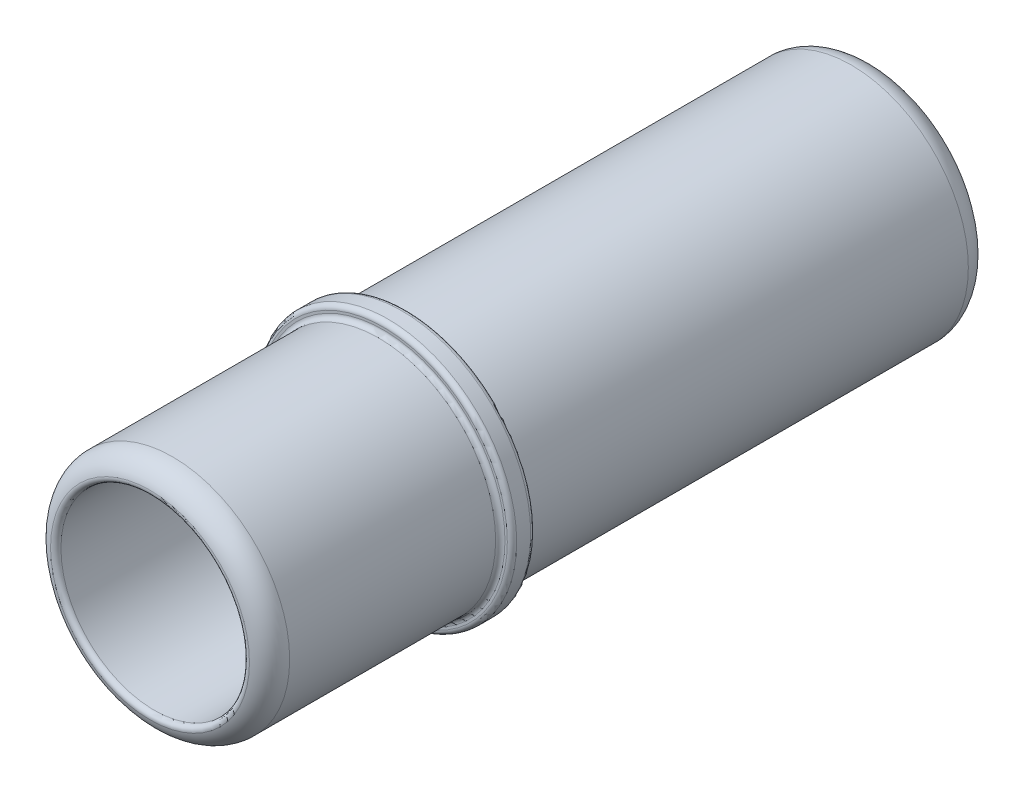
ISO-10303-21;
HEADER;
FILE_DESCRIPTION(('STEP AP214'),'2;1');
FILE_NAME('part.step','',(''),(''),'','','');
FILE_SCHEMA(('AUTOMOTIVE_DESIGN { 1 0 10303 214 1 1 1 1 }'));
ENDSEC;
DATA;
#1=APPLICATION_CONTEXT('core data for automotive mechanical design processes');
#2=APPLICATION_PROTOCOL_DEFINITION('international standard','automotive_design',2000,#1);
#3=PRODUCT_CONTEXT('',#1,'mechanical');
#4=PRODUCT('Part','Part','',(#3));
#5=PRODUCT_RELATED_PRODUCT_CATEGORY('part','',(#4));
#6=PRODUCT_DEFINITION_FORMATION('','',#4);
#7=PRODUCT_DEFINITION_CONTEXT('part definition',#1,'design');
#8=PRODUCT_DEFINITION('design','',#6,#7);
#9=PRODUCT_DEFINITION_SHAPE('','',#8);
#10=(LENGTH_UNIT() NAMED_UNIT(*) SI_UNIT(.MILLI.,.METRE.));
#11=(NAMED_UNIT(*) PLANE_ANGLE_UNIT() SI_UNIT($,.RADIAN.));
#12=(NAMED_UNIT(*) SI_UNIT($,.STERADIAN.) SOLID_ANGLE_UNIT());
#13=UNCERTAINTY_MEASURE_WITH_UNIT(LENGTH_MEASURE(1.E-05),#10,'distance_accuracy_value','');
#14=(GEOMETRIC_REPRESENTATION_CONTEXT(3) GLOBAL_UNCERTAINTY_ASSIGNED_CONTEXT((#13)) GLOBAL_UNIT_ASSIGNED_CONTEXT((#10,
#11,#12)) REPRESENTATION_CONTEXT('',''));
#15=CARTESIAN_POINT('',(0.,0.,0.));
#16=DIRECTION('',(0.,0.,1.));
#17=DIRECTION('',(1.,0.,0.));
#18=AXIS2_PLACEMENT_3D('',#15,#16,#17);
#19=CARTESIAN_POINT('',(0.,0.,1.07745966692415));
#20=DIRECTION('',(0.,0.,-1.));
#21=DIRECTION('',(-1.,0.,0.));
#22=AXIS2_PLACEMENT_3D('',#19,#20,#21);
#23=TOROIDAL_SURFACE('',#22,0.42,0.02);
#24=CARTESIAN_POINT('',(0.,0.,1.07745966692415));
#25=DIRECTION('',(0.,0.,-1.));
#26=DIRECTION('',(-1.,0.,0.));
#27=AXIS2_PLACEMENT_3D('',#24,#25,#26);
#28=CIRCLE('',#27,0.4);
#29=CARTESIAN_POINT('',(-0.4,0.,1.07745966692415));
#30=VERTEX_POINT('',#29);
#31=EDGE_CURVE('E39',#30,#30,#28,.F.);
#32=ORIENTED_EDGE('',*,*,#31,.F.);
#33=EDGE_LOOP('',(#32));
#34=FACE_BOUND('',#33,.T.);
#35=CARTESIAN_POINT('',(0.,0.,1.09682458365518));
#36=DIRECTION('',(0.,0.,-1.));
#37=DIRECTION('',(-1.,0.,0.));
#38=AXIS2_PLACEMENT_3D('',#35,#36,#37);
#39=CIRCLE('',#38,0.424999999999999);
#40=CARTESIAN_POINT('',(-0.424999999999999,0.,1.09682458365518));
#41=VERTEX_POINT('',#40);
#42=EDGE_CURVE('E10',#41,#41,#39,.T.);
#43=ORIENTED_EDGE('',*,*,#42,.F.);
#44=EDGE_LOOP('',(#43));
#45=FACE_BOUND('',#44,.T.);
#46=ADVANCED_FACE('F33',(#34,#45),#23,.T.);
#47=CARTESIAN_POINT('',(0.,0.,-1.97745966692415));
#48=DIRECTION('',(0.,0.,1.));
#49=DIRECTION('',(1.,0.,0.));
#50=AXIS2_PLACEMENT_3D('',#47,#48,#49);
#51=TOROIDAL_SURFACE('',#50,0.42,0.02);
#52=CARTESIAN_POINT('',(0.,0.,-1.97745966692415));
#53=DIRECTION('',(0.,0.,1.));
#54=DIRECTION('',(1.,0.,0.));
#55=AXIS2_PLACEMENT_3D('',#52,#53,#54);
#56=CIRCLE('',#55,0.4);
#57=CARTESIAN_POINT('',(0.4,0.,-1.97745966692415));
#58=VERTEX_POINT('',#57);
#59=EDGE_CURVE('E47',#58,#58,#56,.F.);
#60=ORIENTED_EDGE('',*,*,#59,.F.);
#61=EDGE_LOOP('',(#60));
#62=FACE_BOUND('',#61,.T.);
#63=CARTESIAN_POINT('',(0.,0.,-1.99682458365518));
#64=DIRECTION('',(0.,0.,1.));
#65=DIRECTION('',(1.,0.,0.));
#66=AXIS2_PLACEMENT_3D('',#63,#64,#65);
#67=CIRCLE('',#66,0.424999999999998);
#68=CARTESIAN_POINT('',(0.424999999999998,0.,-1.99682458365518));
#69=VERTEX_POINT('',#68);
#70=EDGE_CURVE('E43',#69,#69,#67,.T.);
#71=ORIENTED_EDGE('',*,*,#70,.F.);
#72=EDGE_LOOP('',(#71));
#73=FACE_BOUND('',#72,.T.);
#74=ADVANCED_FACE('F101',(#62,#73),#51,.T.);
#75=CARTESIAN_POINT('',(0.,0.,0.12));
#76=DIRECTION('',(0.,0.,1.));
#77=DIRECTION('',(1.,0.,0.));
#78=AXIS2_PLACEMENT_3D('',#75,#76,#77);
#79=TOROIDAL_SURFACE('',#78,0.52,0.02);
#80=CARTESIAN_POINT('',(0.,0.,0.12));
#81=DIRECTION('',(0.,0.,1.));
#82=DIRECTION('',(1.,0.,0.));
#83=AXIS2_PLACEMENT_3D('',#80,#81,#82);
#84=CIRCLE('',#83,0.5);
#85=CARTESIAN_POINT('',(0.5,0.,0.12));
#86=VERTEX_POINT('',#85);
#87=EDGE_CURVE('E55',#86,#86,#84,.T.);
#88=ORIENTED_EDGE('',*,*,#87,.F.);
#89=EDGE_LOOP('',(#88));
#90=FACE_BOUND('',#89,.T.);
#91=CARTESIAN_POINT('',(0.,0.,0.1));
#92=DIRECTION('',(0.,0.,1.));
#93=DIRECTION('',(1.,0.,0.));
#94=AXIS2_PLACEMENT_3D('',#91,#92,#93);
#95=CIRCLE('',#94,0.52);
#96=CARTESIAN_POINT('',(0.52,0.,0.1));
#97=VERTEX_POINT('',#96);
#98=EDGE_CURVE('E52',#97,#97,#95,.F.);
#99=ORIENTED_EDGE('',*,*,#98,.F.);
#100=EDGE_LOOP('',(#99));
#101=FACE_BOUND('',#100,.T.);
#102=ADVANCED_FACE('F106',(#90,#101),#79,.F.);
#103=CARTESIAN_POINT('',(0.,0.,-0.0200000000000001));
#104=DIRECTION('',(0.,0.,1.));
#105=DIRECTION('',(1.,0.,0.));
#106=AXIS2_PLACEMENT_3D('',#103,#104,#105);
#107=TOROIDAL_SURFACE('',#106,0.52,0.02);
#108=CARTESIAN_POINT('',(0.,0.,-0.0200000000000001));
#109=DIRECTION('',(0.,0.,1.));
#110=DIRECTION('',(1.,0.,0.));
#111=AXIS2_PLACEMENT_3D('',#108,#109,#110);
#112=CIRCLE('',#111,0.5);
#113=CARTESIAN_POINT('',(0.5,0.,-0.0200000000000001));
#114=VERTEX_POINT('',#113);
#115=EDGE_CURVE('E61',#114,#114,#112,.F.);
#116=ORIENTED_EDGE('',*,*,#115,.F.);
#117=EDGE_LOOP('',(#116));
#118=FACE_BOUND('',#117,.T.);
#119=CARTESIAN_POINT('',(0.,0.,0.));
#120=DIRECTION('',(0.,0.,1.));
#121=DIRECTION('',(1.,0.,0.));
#122=AXIS2_PLACEMENT_3D('',#119,#120,#121);
#123=CIRCLE('',#122,0.52);
#124=CARTESIAN_POINT('',(0.52,0.,0.));
#125=VERTEX_POINT('',#124);
#126=EDGE_CURVE('E58',#125,#125,#123,.T.);
#127=ORIENTED_EDGE('',*,*,#126,.F.);
#128=EDGE_LOOP('',(#127));
#129=FACE_BOUND('',#128,.T.);
#130=ADVANCED_FACE('F112',(#118,#129),#107,.F.);
#131=CARTESIAN_POINT('',(0.,0.,0.02));
#132=DIRECTION('',(0.,0.,1.));
#133=DIRECTION('',(1.,0.,0.));
#134=AXIS2_PLACEMENT_3D('',#131,#132,#133);
#135=TOROIDAL_SURFACE('',#134,0.53,0.02);
#136=CARTESIAN_POINT('',(0.,0.,0.));
#137=DIRECTION('',(0.,0.,1.));
#138=DIRECTION('',(1.,0.,0.));
#139=AXIS2_PLACEMENT_3D('',#136,#137,#138);
#140=CIRCLE('',#139,0.53);
#141=CARTESIAN_POINT('',(0.53,0.,0.));
#142=VERTEX_POINT('',#141);
#143=EDGE_CURVE('E67',#142,#142,#140,.F.);
#144=ORIENTED_EDGE('',*,*,#143,.F.);
#145=EDGE_LOOP('',(#144));
#146=FACE_BOUND('',#145,.T.);
#147=CARTESIAN_POINT('',(0.,0.,0.02));
#148=DIRECTION('',(0.,0.,1.));
#149=DIRECTION('',(1.,0.,0.));
#150=AXIS2_PLACEMENT_3D('',#147,#148,#149);
#151=CIRCLE('',#150,0.55);
#152=CARTESIAN_POINT('',(0.55,0.,0.02));
#153=VERTEX_POINT('',#152);
#154=EDGE_CURVE('E64',#153,#153,#151,.T.);
#155=ORIENTED_EDGE('',*,*,#154,.F.);
#156=EDGE_LOOP('',(#155));
#157=FACE_BOUND('',#156,.T.);
#158=ADVANCED_FACE('F120',(#146,#157),#135,.T.);
#159=CARTESIAN_POINT('',(0.,0.,0.08));
#160=DIRECTION('',(0.,0.,1.));
#161=DIRECTION('',(1.,0.,0.));
#162=AXIS2_PLACEMENT_3D('',#159,#160,#161);
#163=TOROIDAL_SURFACE('',#162,0.53,0.02);
#164=CARTESIAN_POINT('',(0.,0.,0.1));
#165=DIRECTION('',(0.,0.,1.));
#166=DIRECTION('',(1.,0.,0.));
#167=AXIS2_PLACEMENT_3D('',#164,#165,#166);
#168=CIRCLE('',#167,0.53);
#169=CARTESIAN_POINT('',(0.53,0.,0.1));
#170=VERTEX_POINT('',#169);
#171=EDGE_CURVE('E73',#170,#170,#168,.T.);
#172=ORIENTED_EDGE('',*,*,#171,.F.);
#173=EDGE_LOOP('',(#172));
#174=FACE_BOUND('',#173,.T.);
#175=CARTESIAN_POINT('',(0.,0.,0.08));
#176=DIRECTION('',(0.,0.,1.));
#177=DIRECTION('',(1.,0.,0.));
#178=AXIS2_PLACEMENT_3D('',#175,#176,#177);
#179=CIRCLE('',#178,0.55);
#180=CARTESIAN_POINT('',(0.55,0.,0.08));
#181=VERTEX_POINT('',#180);
#182=EDGE_CURVE('E70',#181,#181,#179,.F.);
#183=ORIENTED_EDGE('',*,*,#182,.F.);
#184=EDGE_LOOP('',(#183));
#185=FACE_BOUND('',#184,.T.);
#186=ADVANCED_FACE('F98',(#174,#185),#163,.T.);
#187=CARTESIAN_POINT('',(0.,0.,1.));
#188=DIRECTION('',(0.,0.,1.));
#189=DIRECTION('',(1.,0.,0.));
#190=AXIS2_PLACEMENT_3D('',#187,#188,#189);
#191=TOROIDAL_SURFACE('',#190,0.4,0.1);
#192=ORIENTED_EDGE('',*,*,#42,.T.);
#193=EDGE_LOOP('',(#192));
#194=FACE_BOUND('',#193,.T.);
#195=CARTESIAN_POINT('',(0.,0.,1.));
#196=DIRECTION('',(0.,0.,1.));
#197=DIRECTION('',(1.,0.,0.));
#198=AXIS2_PLACEMENT_3D('',#195,#196,#197);
#199=CIRCLE('',#198,0.5);
#200=CARTESIAN_POINT('',(0.5,0.,1.));
#201=VERTEX_POINT('',#200);
#202=EDGE_CURVE('E76',#201,#201,#199,.F.);
#203=ORIENTED_EDGE('',*,*,#202,.F.);
#204=EDGE_LOOP('',(#203));
#205=FACE_BOUND('',#204,.T.);
#206=ADVANCED_FACE('F88',(#194,#205),#191,.T.);
#207=CARTESIAN_POINT('',(0.,0.,-1.9));
#208=DIRECTION('',(0.,0.,-1.));
#209=DIRECTION('',(-1.,0.,0.));
#210=AXIS2_PLACEMENT_3D('',#207,#208,#209);
#211=TOROIDAL_SURFACE('',#210,0.4,0.1);
#212=ORIENTED_EDGE('',*,*,#70,.T.);
#213=EDGE_LOOP('',(#212));
#214=FACE_BOUND('',#213,.T.);
#215=CARTESIAN_POINT('',(0.,0.,-1.9));
#216=DIRECTION('',(0.,0.,-1.));
#217=DIRECTION('',(-1.,0.,0.));
#218=AXIS2_PLACEMENT_3D('',#215,#216,#217);
#219=CIRCLE('',#218,0.5);
#220=CARTESIAN_POINT('',(-0.5,0.,-1.9));
#221=VERTEX_POINT('',#220);
#222=EDGE_CURVE('E79',#221,#221,#219,.F.);
#223=ORIENTED_EDGE('',*,*,#222,.F.);
#224=EDGE_LOOP('',(#223));
#225=FACE_BOUND('',#224,.T.);
#226=ADVANCED_FACE('F85',(#214,#225),#211,.T.);
#227=CARTESIAN_POINT('',(0.,0.,0.1));
#228=DIRECTION('',(0.,0.,-1.));
#229=DIRECTION('',(-1.,0.,0.));
#230=AXIS2_PLACEMENT_3D('',#227,#228,#229);
#231=CYLINDRICAL_SURFACE('',#230,0.55);
#232=ORIENTED_EDGE('',*,*,#154,.T.);
#233=EDGE_LOOP('',(#232));
#234=FACE_BOUND('',#233,.T.);
#235=ORIENTED_EDGE('',*,*,#182,.T.);
#236=EDGE_LOOP('',(#235));
#237=FACE_BOUND('',#236,.T.);
#238=ADVANCED_FACE('F87',(#234,#237),#231,.T.);
#239=CARTESIAN_POINT('',(0.,0.,0.1));
#240=DIRECTION('',(0.,0.,1.));
#241=DIRECTION('',(1.,0.,0.));
#242=AXIS2_PLACEMENT_3D('',#239,#240,#241);
#243=PLANE('',#242);
#244=ORIENTED_EDGE('',*,*,#98,.T.);
#245=EDGE_LOOP('',(#244));
#246=FACE_BOUND('',#245,.T.);
#247=ORIENTED_EDGE('',*,*,#171,.T.);
#248=EDGE_LOOP('',(#247));
#249=FACE_BOUND('',#248,.T.);
#250=ADVANCED_FACE('F95',(#246,#249),#243,.T.);
#251=CARTESIAN_POINT('',(0.,0.,0.));
#252=DIRECTION('',(0.,0.,1.));
#253=DIRECTION('',(1.,0.,0.));
#254=AXIS2_PLACEMENT_3D('',#251,#252,#253);
#255=PLANE('',#254);
#256=ORIENTED_EDGE('',*,*,#126,.T.);
#257=EDGE_LOOP('',(#256));
#258=FACE_BOUND('',#257,.T.);
#259=ORIENTED_EDGE('',*,*,#143,.T.);
#260=EDGE_LOOP('',(#259));
#261=FACE_BOUND('',#260,.T.);
#262=ADVANCED_FACE('F135',(#258,#261),#255,.F.);
#263=CARTESIAN_POINT('',(0.,0.,1.1));
#264=DIRECTION('',(0.,0.,-1.));
#265=DIRECTION('',(-1.,0.,0.));
#266=AXIS2_PLACEMENT_3D('',#263,#264,#265);
#267=CYLINDRICAL_SURFACE('',#266,0.5);
#268=ORIENTED_EDGE('',*,*,#87,.T.);
#269=EDGE_LOOP('',(#268));
#270=FACE_BOUND('',#269,.T.);
#271=ORIENTED_EDGE('',*,*,#202,.T.);
#272=EDGE_LOOP('',(#271));
#273=FACE_BOUND('',#272,.T.);
#274=ADVANCED_FACE('F141',(#270,#273),#267,.T.);
#275=CARTESIAN_POINT('',(0.,0.,-2.));
#276=DIRECTION('',(0.,0.,1.));
#277=DIRECTION('',(1.,0.,0.));
#278=AXIS2_PLACEMENT_3D('',#275,#276,#277);
#279=CYLINDRICAL_SURFACE('',#278,0.5);
#280=ORIENTED_EDGE('',*,*,#115,.T.);
#281=EDGE_LOOP('',(#280));
#282=FACE_BOUND('',#281,.T.);
#283=ORIENTED_EDGE('',*,*,#222,.T.);
#284=EDGE_LOOP('',(#283));
#285=FACE_BOUND('',#284,.T.);
#286=ADVANCED_FACE('F83',(#282,#285),#279,.T.);
#287=CARTESIAN_POINT('',(0.,0.,1.1));
#288=DIRECTION('',(0.,0.,-1.));
#289=DIRECTION('',(-1.,0.,0.));
#290=AXIS2_PLACEMENT_3D('',#287,#288,#289);
#291=CYLINDRICAL_SURFACE('',#290,0.4);
#292=ORIENTED_EDGE('',*,*,#31,.T.);
#293=EDGE_LOOP('',(#292));
#294=FACE_BOUND('',#293,.T.);
#295=ORIENTED_EDGE('',*,*,#59,.T.);
#296=EDGE_LOOP('',(#295));
#297=FACE_BOUND('',#296,.T.);
#298=ADVANCED_FACE('F150',(#294,#297),#291,.F.);
#299=CLOSED_SHELL('',(#46,#74,#102,#130,#158,#186,#206,#226,#238,#250,#262,#274,#286,#298));
#300=MANIFOLD_SOLID_BREP('B2',#299);
#301=ADVANCED_BREP_SHAPE_REPRESENTATION('',(#18,#300),#14);
#302=SHAPE_DEFINITION_REPRESENTATION(#9,#301);
ENDSEC;
END-ISO-10303-21;
